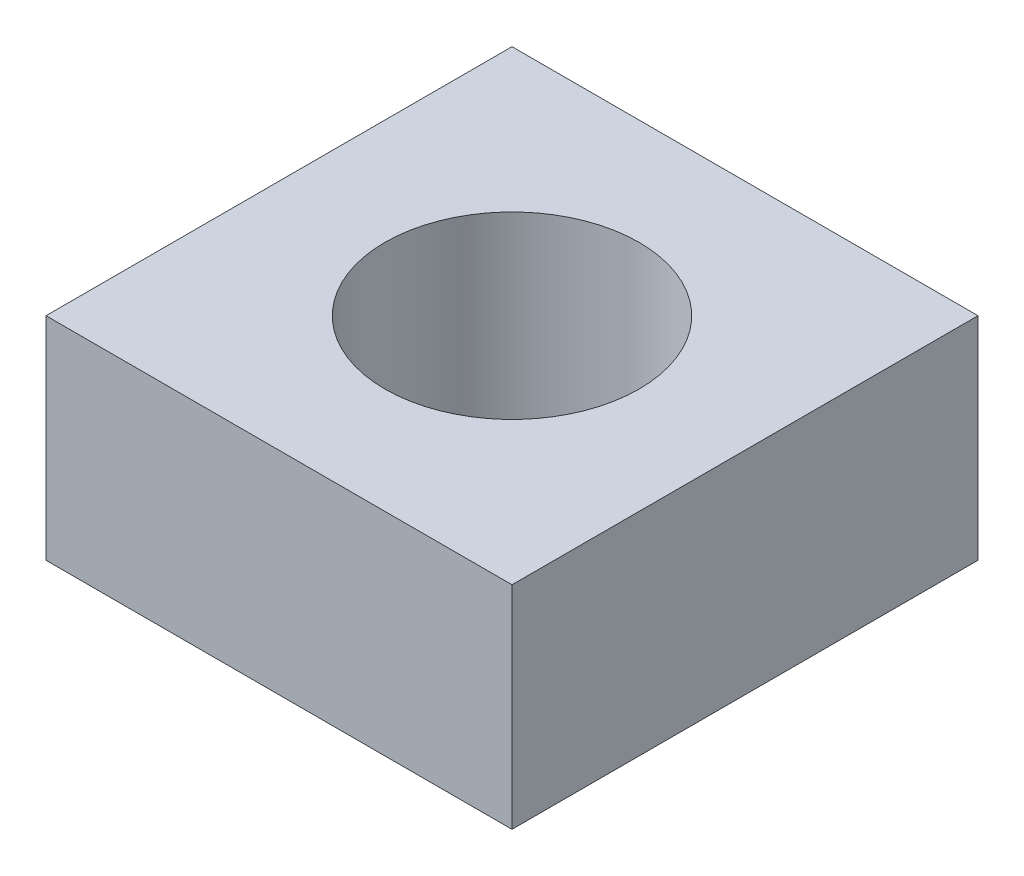
ISO-10303-21;
HEADER;
FILE_DESCRIPTION(('STEP AP214'),'2;1');
FILE_NAME('part.step','',(''),(''),'','','');
FILE_SCHEMA(('AUTOMOTIVE_DESIGN { 1 0 10303 214 1 1 1 1 }'));
ENDSEC;
DATA;
#1=APPLICATION_CONTEXT('core data for automotive mechanical design processes');
#2=APPLICATION_PROTOCOL_DEFINITION('international standard','automotive_design',2000,#1);
#3=PRODUCT_CONTEXT('',#1,'mechanical');
#4=PRODUCT('Part','Part','',(#3));
#5=PRODUCT_RELATED_PRODUCT_CATEGORY('part','',(#4));
#6=PRODUCT_DEFINITION_FORMATION('','',#4);
#7=PRODUCT_DEFINITION_CONTEXT('part definition',#1,'design');
#8=PRODUCT_DEFINITION('design','',#6,#7);
#9=PRODUCT_DEFINITION_SHAPE('','',#8);
#10=(LENGTH_UNIT() NAMED_UNIT(*) SI_UNIT(.MILLI.,.METRE.));
#11=(NAMED_UNIT(*) PLANE_ANGLE_UNIT() SI_UNIT($,.RADIAN.));
#12=(NAMED_UNIT(*) SI_UNIT($,.STERADIAN.) SOLID_ANGLE_UNIT());
#13=UNCERTAINTY_MEASURE_WITH_UNIT(LENGTH_MEASURE(1.E-05),#10,'distance_accuracy_value','');
#14=(GEOMETRIC_REPRESENTATION_CONTEXT(3) GLOBAL_UNCERTAINTY_ASSIGNED_CONTEXT((#13)) GLOBAL_UNIT_ASSIGNED_CONTEXT((#10,
#11,#12)) REPRESENTATION_CONTEXT('',''));
#15=CARTESIAN_POINT('',(0.,0.,0.));
#16=DIRECTION('',(0.,0.,1.));
#17=DIRECTION('',(1.,0.,0.));
#18=AXIS2_PLACEMENT_3D('',#15,#16,#17);
#19=CARTESIAN_POINT('',(0.,2.5,0.));
#20=DIRECTION('',(0.,-1.,0.));
#21=DIRECTION('',(0.,0.,-1.));
#22=AXIS2_PLACEMENT_3D('',#19,#20,#21);
#23=PLANE('',#22);
#24=DIRECTION('',(0.,0.,-1.));
#25=VECTOR('',#24,1.);
#26=CARTESIAN_POINT('',(2.75,2.5,2.75));
#27=LINE('',#26,#25);
#28=CARTESIAN_POINT('',(2.75,2.5,2.75));
#29=VERTEX_POINT('',#28);
#30=CARTESIAN_POINT('',(2.75,2.5,-2.75));
#31=VERTEX_POINT('',#30);
#32=EDGE_CURVE('E89',#29,#31,#27,.T.);
#33=ORIENTED_EDGE('',*,*,#32,.T.);
#34=DIRECTION('',(-1.,0.,0.));
#35=VECTOR('',#34,1.);
#36=CARTESIAN_POINT('',(-2.75,2.5,-2.75));
#37=LINE('',#36,#35);
#38=CARTESIAN_POINT('',(-2.75,2.5,-2.75));
#39=VERTEX_POINT('',#38);
#40=EDGE_CURVE('E84',#31,#39,#37,.T.);
#41=ORIENTED_EDGE('',*,*,#40,.T.);
#42=DIRECTION('',(0.,0.,1.));
#43=VECTOR('',#42,1.);
#44=CARTESIAN_POINT('',(-2.75,2.5,2.75));
#45=LINE('',#44,#43);
#46=CARTESIAN_POINT('',(-2.75,2.5,2.75));
#47=VERTEX_POINT('',#46);
#48=EDGE_CURVE('E87',#39,#47,#45,.T.);
#49=ORIENTED_EDGE('',*,*,#48,.T.);
#50=DIRECTION('',(1.,0.,0.));
#51=VECTOR('',#50,1.);
#52=CARTESIAN_POINT('',(-2.75,2.5,2.75));
#53=LINE('',#52,#51);
#54=EDGE_CURVE('E54',#47,#29,#53,.T.);
#55=ORIENTED_EDGE('',*,*,#54,.T.);
#56=EDGE_LOOP('',(#33,#41,#49,#55));
#57=FACE_BOUND('',#56,.T.);
#58=CARTESIAN_POINT('',(0.,2.5,0.));
#59=DIRECTION('',(0.,1.,0.));
#60=DIRECTION('',(0.,0.,1.));
#61=AXIS2_PLACEMENT_3D('',#58,#59,#60);
#62=CIRCLE('',#61,1.5);
#63=CARTESIAN_POINT('',(0.,2.5,1.5));
#64=VERTEX_POINT('',#63);
#65=EDGE_CURVE('E104',#64,#64,#62,.T.);
#66=ORIENTED_EDGE('',*,*,#65,.F.);
#67=EDGE_LOOP('',(#66));
#68=FACE_BOUND('',#67,.T.);
#69=ADVANCED_FACE('F37',(#57,#68),#23,.F.);
#70=CARTESIAN_POINT('',(0.,0.,0.));
#71=DIRECTION('',(0.,-1.,0.));
#72=DIRECTION('',(0.,0.,-1.));
#73=AXIS2_PLACEMENT_3D('',#70,#71,#72);
#74=PLANE('',#73);
#75=DIRECTION('',(0.,0.,-1.));
#76=VECTOR('',#75,1.);
#77=CARTESIAN_POINT('',(2.75,0.,2.75));
#78=LINE('',#77,#76);
#79=CARTESIAN_POINT('',(2.75,0.,2.75));
#80=VERTEX_POINT('',#79);
#81=CARTESIAN_POINT('',(2.75,0.,-2.75));
#82=VERTEX_POINT('',#81);
#83=EDGE_CURVE('E101',#80,#82,#78,.T.);
#84=ORIENTED_EDGE('',*,*,#83,.F.);
#85=DIRECTION('',(1.,0.,0.));
#86=VECTOR('',#85,1.);
#87=CARTESIAN_POINT('',(-2.75,0.,2.75));
#88=LINE('',#87,#86);
#89=CARTESIAN_POINT('',(-2.75,0.,2.75));
#90=VERTEX_POINT('',#89);
#91=EDGE_CURVE('E77',#90,#80,#88,.T.);
#92=ORIENTED_EDGE('',*,*,#91,.F.);
#93=DIRECTION('',(0.,0.,1.));
#94=VECTOR('',#93,1.);
#95=CARTESIAN_POINT('',(-2.75,0.,2.75));
#96=LINE('',#95,#94);
#97=CARTESIAN_POINT('',(-2.75,0.,-2.75));
#98=VERTEX_POINT('',#97);
#99=EDGE_CURVE('E71',#98,#90,#96,.T.);
#100=ORIENTED_EDGE('',*,*,#99,.F.);
#101=DIRECTION('',(-1.,0.,0.));
#102=VECTOR('',#101,1.);
#103=CARTESIAN_POINT('',(-2.75,0.,-2.75));
#104=LINE('',#103,#102);
#105=EDGE_CURVE('E93',#82,#98,#104,.T.);
#106=ORIENTED_EDGE('',*,*,#105,.F.);
#107=EDGE_LOOP('',(#84,#92,#100,#106));
#108=FACE_BOUND('',#107,.T.);
#109=CARTESIAN_POINT('',(0.,0.,0.));
#110=DIRECTION('',(0.,1.,0.));
#111=DIRECTION('',(0.,0.,1.));
#112=AXIS2_PLACEMENT_3D('',#109,#110,#111);
#113=CIRCLE('',#112,1.5);
#114=CARTESIAN_POINT('',(0.,0.,1.5));
#115=VERTEX_POINT('',#114);
#116=EDGE_CURVE('E116',#115,#115,#113,.T.);
#117=ORIENTED_EDGE('',*,*,#116,.T.);
#118=EDGE_LOOP('',(#117));
#119=FACE_BOUND('',#118,.T.);
#120=ADVANCED_FACE('F112',(#108,#119),#74,.T.);
#121=CARTESIAN_POINT('',(2.75,2.5,2.75));
#122=DIRECTION('',(-1.,0.,0.));
#123=DIRECTION('',(0.,0.,1.));
#124=AXIS2_PLACEMENT_3D('',#121,#122,#123);
#125=PLANE('',#124);
#126=ORIENTED_EDGE('',*,*,#83,.T.);
#127=DIRECTION('',(0.,-1.,0.));
#128=VECTOR('',#127,1.);
#129=CARTESIAN_POINT('',(2.75,2.5,-2.75));
#130=LINE('',#129,#128);
#131=EDGE_CURVE('E11',#31,#82,#130,.T.);
#132=ORIENTED_EDGE('',*,*,#131,.F.);
#133=ORIENTED_EDGE('',*,*,#32,.F.);
#134=DIRECTION('',(0.,-1.,0.));
#135=VECTOR('',#134,1.);
#136=CARTESIAN_POINT('',(2.75,2.5,2.75));
#137=LINE('',#136,#135);
#138=EDGE_CURVE('E97',#29,#80,#137,.T.);
#139=ORIENTED_EDGE('',*,*,#138,.T.);
#140=EDGE_LOOP('',(#126,#132,#133,#139));
#141=FACE_BOUND('',#140,.T.);
#142=ADVANCED_FACE('F39',(#141),#125,.F.);
#143=CARTESIAN_POINT('',(-2.75,2.5,-2.75));
#144=DIRECTION('',(0.,0.,1.));
#145=DIRECTION('',(1.,0.,0.));
#146=AXIS2_PLACEMENT_3D('',#143,#144,#145);
#147=PLANE('',#146);
#148=ORIENTED_EDGE('',*,*,#105,.T.);
#149=DIRECTION('',(0.,-1.,0.));
#150=VECTOR('',#149,1.);
#151=CARTESIAN_POINT('',(-2.75,2.5,-2.75));
#152=LINE('',#151,#150);
#153=EDGE_CURVE('E46',#39,#98,#152,.T.);
#154=ORIENTED_EDGE('',*,*,#153,.F.);
#155=ORIENTED_EDGE('',*,*,#40,.F.);
#156=ORIENTED_EDGE('',*,*,#131,.T.);
#157=EDGE_LOOP('',(#148,#154,#155,#156));
#158=FACE_BOUND('',#157,.T.);
#159=ADVANCED_FACE('F92',(#158),#147,.F.);
#160=CARTESIAN_POINT('',(-2.75,2.5,2.75));
#161=DIRECTION('',(1.,0.,0.));
#162=DIRECTION('',(0.,0.,-1.));
#163=AXIS2_PLACEMENT_3D('',#160,#161,#162);
#164=PLANE('',#163);
#165=ORIENTED_EDGE('',*,*,#99,.T.);
#166=DIRECTION('',(0.,-1.,0.));
#167=VECTOR('',#166,1.);
#168=CARTESIAN_POINT('',(-2.75,2.5,2.75));
#169=LINE('',#168,#167);
#170=EDGE_CURVE('E94',#47,#90,#169,.T.);
#171=ORIENTED_EDGE('',*,*,#170,.F.);
#172=ORIENTED_EDGE('',*,*,#48,.F.);
#173=ORIENTED_EDGE('',*,*,#153,.T.);
#174=EDGE_LOOP('',(#165,#171,#172,#173));
#175=FACE_BOUND('',#174,.T.);
#176=ADVANCED_FACE('F95',(#175),#164,.F.);
#177=CARTESIAN_POINT('',(-2.75,2.5,2.75));
#178=DIRECTION('',(0.,0.,-1.));
#179=DIRECTION('',(-1.,0.,0.));
#180=AXIS2_PLACEMENT_3D('',#177,#178,#179);
#181=PLANE('',#180);
#182=ORIENTED_EDGE('',*,*,#91,.T.);
#183=ORIENTED_EDGE('',*,*,#138,.F.);
#184=ORIENTED_EDGE('',*,*,#54,.F.);
#185=ORIENTED_EDGE('',*,*,#170,.T.);
#186=EDGE_LOOP('',(#182,#183,#184,#185));
#187=FACE_BOUND('',#186,.T.);
#188=ADVANCED_FACE('F109',(#187),#181,.F.);
#189=CARTESIAN_POINT('',(0.,2.5,0.));
#190=DIRECTION('',(0.,-1.,0.));
#191=DIRECTION('',(0.,0.,-1.));
#192=AXIS2_PLACEMENT_3D('',#189,#190,#191);
#193=CYLINDRICAL_SURFACE('',#192,1.5);
#194=ORIENTED_EDGE('',*,*,#65,.T.);
#195=EDGE_LOOP('',(#194));
#196=FACE_BOUND('',#195,.T.);
#197=ORIENTED_EDGE('',*,*,#116,.F.);
#198=EDGE_LOOP('',(#197));
#199=FACE_BOUND('',#198,.T.);
#200=ADVANCED_FACE('F122',(#196,#199),#193,.F.);
#201=CLOSED_SHELL('',(#69,#120,#142,#159,#176,#188,#200));
#202=MANIFOLD_SOLID_BREP('B2',#201);
#203=ADVANCED_BREP_SHAPE_REPRESENTATION('',(#18,#202),#14);
#204=SHAPE_DEFINITION_REPRESENTATION(#9,#203);
ENDSEC;
END-ISO-10303-21;
